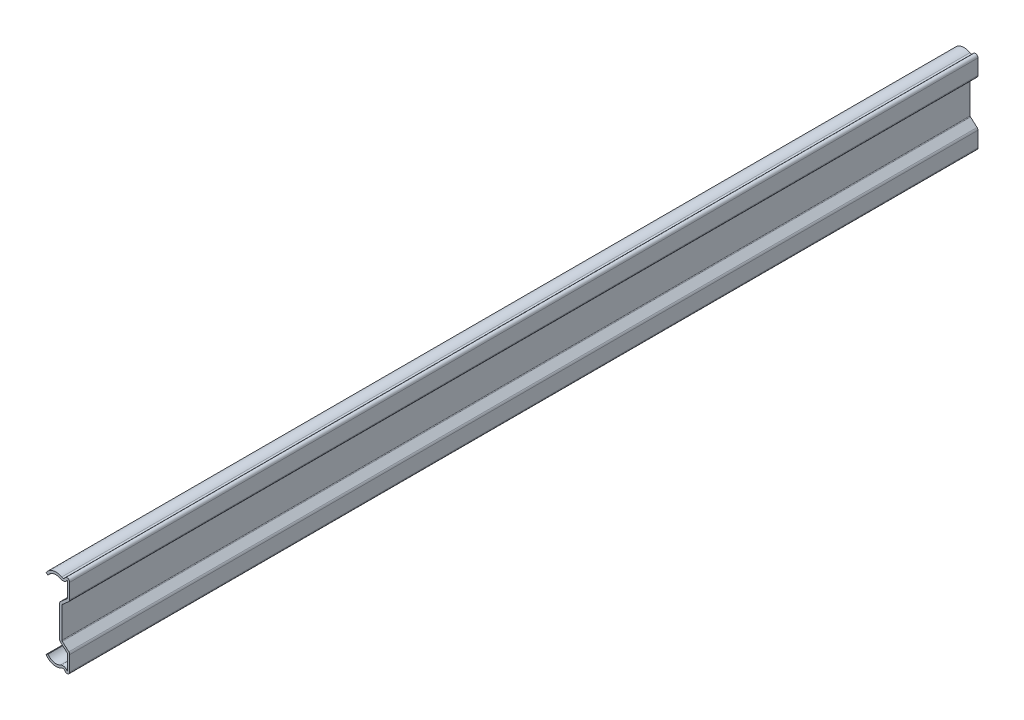
ISO-10303-21;
HEADER;
FILE_DESCRIPTION(('STEP AP214'),'2;1');
FILE_NAME('part.step','',(''),(''),'','','');
FILE_SCHEMA(('AUTOMOTIVE_DESIGN { 1 0 10303 214 1 1 1 1 }'));
ENDSEC;
DATA;
#1=APPLICATION_CONTEXT('core data for automotive mechanical design processes');
#2=APPLICATION_PROTOCOL_DEFINITION('international standard','automotive_design',2000,#1);
#3=PRODUCT_CONTEXT('',#1,'mechanical');
#4=PRODUCT('Part','Part','',(#3));
#5=PRODUCT_RELATED_PRODUCT_CATEGORY('part','',(#4));
#6=PRODUCT_DEFINITION_FORMATION('','',#4);
#7=PRODUCT_DEFINITION_CONTEXT('part definition',#1,'design');
#8=PRODUCT_DEFINITION('design','',#6,#7);
#9=PRODUCT_DEFINITION_SHAPE('','',#8);
#10=(LENGTH_UNIT() NAMED_UNIT(*) SI_UNIT(.MILLI.,.METRE.));
#11=(NAMED_UNIT(*) PLANE_ANGLE_UNIT() SI_UNIT($,.RADIAN.));
#12=(NAMED_UNIT(*) SI_UNIT($,.STERADIAN.) SOLID_ANGLE_UNIT());
#13=UNCERTAINTY_MEASURE_WITH_UNIT(LENGTH_MEASURE(1.E-05),#10,'distance_accuracy_value','');
#14=(GEOMETRIC_REPRESENTATION_CONTEXT(3) GLOBAL_UNCERTAINTY_ASSIGNED_CONTEXT((#13)) GLOBAL_UNIT_ASSIGNED_CONTEXT((#10,
#11,#12)) REPRESENTATION_CONTEXT('',''));
#15=CARTESIAN_POINT('',(0.,0.,0.));
#16=DIRECTION('',(0.,0.,1.));
#17=DIRECTION('',(1.,0.,0.));
#18=AXIS2_PLACEMENT_3D('',#15,#16,#17);
#19=CARTESIAN_POINT('',(-2.6,-10.,-137.));
#20=DIRECTION('',(0.,0.,1.));
#21=DIRECTION('',(1.,0.,0.));
#22=AXIS2_PLACEMENT_3D('',#19,#20,#21);
#23=CYLINDRICAL_SURFACE('',#22,1.1);
#24=DIRECTION('',(0.,0.,-1.));
#25=VECTOR('',#24,1.);
#26=CARTESIAN_POINT('',(-1.5,-10.,-137.));
#27=LINE('',#26,#25);
#28=CARTESIAN_POINT('',(-1.5,-10.,-137.));
#29=VERTEX_POINT('',#28);
#30=CARTESIAN_POINT('',(-1.5,-10.,246.));
#31=VERTEX_POINT('',#30);
#32=EDGE_CURVE('E227',#29,#31,#27,.F.);
#33=ORIENTED_EDGE('',*,*,#32,.F.);
#34=CARTESIAN_POINT('',(-2.6,-10.,-137.));
#35=DIRECTION('',(0.,0.,1.));
#36=DIRECTION('',(1.,0.,0.));
#37=AXIS2_PLACEMENT_3D('',#34,#35,#36);
#38=CIRCLE('',#37,1.1);
#39=CARTESIAN_POINT('',(-1.87795841654397,-9.17014703003465,-137.));
#40=VERTEX_POINT('',#39);
#41=EDGE_CURVE('E232',#29,#40,#38,.T.);
#42=ORIENTED_EDGE('',*,*,#41,.T.);
#43=DIRECTION('',(0.,0.,1.));
#44=VECTOR('',#43,1.);
#45=CARTESIAN_POINT('',(-1.87795841654397,-9.17014703003465,-137.));
#46=LINE('',#45,#44);
#47=CARTESIAN_POINT('',(-1.87795841654397,-9.17014703003465,246.));
#48=VERTEX_POINT('',#47);
#49=EDGE_CURVE('E230',#48,#40,#46,.F.);
#50=ORIENTED_EDGE('',*,*,#49,.F.);
#51=CARTESIAN_POINT('',(-2.6,-10.,246.));
#52=DIRECTION('',(0.,0.,1.));
#53=DIRECTION('',(1.,0.,0.));
#54=AXIS2_PLACEMENT_3D('',#51,#52,#53);
#55=CIRCLE('',#54,1.1);
#56=EDGE_CURVE('E20',#48,#31,#55,.F.);
#57=ORIENTED_EDGE('',*,*,#56,.T.);
#58=EDGE_LOOP('',(#33,#42,#50,#57));
#59=FACE_BOUND('',#58,.T.);
#60=ADVANCED_FACE('F16',(#59),#23,.T.);
#61=CARTESIAN_POINT('',(-4.3,-6.4,-137.));
#62=DIRECTION('',(0.,0.,1.));
#63=DIRECTION('',(1.,0.,0.));
#64=AXIS2_PLACEMENT_3D('',#61,#62,#63);
#65=CYLINDRICAL_SURFACE('',#64,0.5);
#66=DIRECTION('',(0.,0.,-1.));
#67=VECTOR('',#66,1.);
#68=CARTESIAN_POINT('',(-4.8,-6.4,-137.));
#69=LINE('',#68,#67);
#70=CARTESIAN_POINT('',(-4.8,-6.4,246.));
#71=VERTEX_POINT('',#70);
#72=CARTESIAN_POINT('',(-4.8,-6.4,-137.));
#73=VERTEX_POINT('',#72);
#74=EDGE_CURVE('E331',#71,#73,#69,.T.);
#75=ORIENTED_EDGE('',*,*,#74,.F.);
#76=CARTESIAN_POINT('',(-4.3,-6.4,246.));
#77=DIRECTION('',(0.,0.,1.));
#78=DIRECTION('',(1.,0.,0.));
#79=AXIS2_PLACEMENT_3D('',#76,#77,#78);
#80=CIRCLE('',#79,0.5);
#81=CARTESIAN_POINT('',(-4.62820071975274,-6.77720589543879,246.));
#82=VERTEX_POINT('',#81);
#83=EDGE_CURVE('E444',#82,#71,#80,.F.);
#84=ORIENTED_EDGE('',*,*,#83,.F.);
#85=DIRECTION('',(0.,0.,1.));
#86=VECTOR('',#85,1.);
#87=CARTESIAN_POINT('',(-4.62820071975274,-6.77720589543879,-137.));
#88=LINE('',#87,#86);
#89=CARTESIAN_POINT('',(-4.62820071975274,-6.77720589543879,-137.));
#90=VERTEX_POINT('',#89);
#91=EDGE_CURVE('E337',#90,#82,#88,.T.);
#92=ORIENTED_EDGE('',*,*,#91,.F.);
#93=CARTESIAN_POINT('',(-4.3,-6.4,-137.));
#94=DIRECTION('',(0.,0.,1.));
#95=DIRECTION('',(1.,0.,0.));
#96=AXIS2_PLACEMENT_3D('',#93,#94,#95);
#97=CIRCLE('',#96,0.5);
#98=EDGE_CURVE('E442',#73,#90,#97,.T.);
#99=ORIENTED_EDGE('',*,*,#98,.F.);
#100=EDGE_LOOP('',(#75,#84,#92,#99));
#101=FACE_BOUND('',#100,.T.);
#102=ADVANCED_FACE('F788',(#101),#65,.F.);
#103=CARTESIAN_POINT('',(-4.3,6.4,-137.));
#104=DIRECTION('',(0.,0.,1.));
#105=DIRECTION('',(1.,0.,0.));
#106=AXIS2_PLACEMENT_3D('',#103,#104,#105);
#107=CYLINDRICAL_SURFACE('',#106,0.5);
#108=DIRECTION('',(0.,0.,1.));
#109=VECTOR('',#108,1.);
#110=CARTESIAN_POINT('',(-4.62820071975274,6.77720589543879,-137.));
#111=LINE('',#110,#109);
#112=CARTESIAN_POINT('',(-4.62820071975274,6.77720589543879,246.));
#113=VERTEX_POINT('',#112);
#114=CARTESIAN_POINT('',(-4.62820071975274,6.77720589543879,-137.));
#115=VERTEX_POINT('',#114);
#116=EDGE_CURVE('E325',#113,#115,#111,.F.);
#117=ORIENTED_EDGE('',*,*,#116,.F.);
#118=CARTESIAN_POINT('',(-4.3,6.4,246.));
#119=DIRECTION('',(0.,0.,1.));
#120=DIRECTION('',(1.,0.,0.));
#121=AXIS2_PLACEMENT_3D('',#118,#119,#120);
#122=CIRCLE('',#121,0.5);
#123=CARTESIAN_POINT('',(-4.8,6.4,246.));
#124=VERTEX_POINT('',#123);
#125=EDGE_CURVE('E440',#124,#113,#122,.F.);
#126=ORIENTED_EDGE('',*,*,#125,.F.);
#127=DIRECTION('',(0.,0.,-1.));
#128=VECTOR('',#127,1.);
#129=CARTESIAN_POINT('',(-4.8,6.4,-137.));
#130=LINE('',#129,#128);
#131=CARTESIAN_POINT('',(-4.8,6.4,-137.));
#132=VERTEX_POINT('',#131);
#133=EDGE_CURVE('E334',#132,#124,#130,.F.);
#134=ORIENTED_EDGE('',*,*,#133,.F.);
#135=CARTESIAN_POINT('',(-4.3,6.4,-137.));
#136=DIRECTION('',(0.,0.,1.));
#137=DIRECTION('',(1.,0.,0.));
#138=AXIS2_PLACEMENT_3D('',#135,#136,#137);
#139=CIRCLE('',#138,0.5);
#140=EDGE_CURVE('E438',#115,#132,#139,.T.);
#141=ORIENTED_EDGE('',*,*,#140,.F.);
#142=EDGE_LOOP('',(#117,#126,#134,#141));
#143=FACE_BOUND('',#142,.T.);
#144=ADVANCED_FACE('F482',(#143),#107,.F.);
#145=CARTESIAN_POINT('',(-2.6,10.,-137.));
#146=DIRECTION('',(0.,0.,1.));
#147=DIRECTION('',(1.,0.,0.));
#148=AXIS2_PLACEMENT_3D('',#145,#146,#147);
#149=CYLINDRICAL_SURFACE('',#148,1.1);
#150=DIRECTION('',(0.,0.,1.));
#151=VECTOR('',#150,1.);
#152=CARTESIAN_POINT('',(-1.87795841654397,9.17014703003465,-137.));
#153=LINE('',#152,#151);
#154=CARTESIAN_POINT('',(-1.87795841654397,9.17014703003465,-137.));
#155=VERTEX_POINT('',#154);
#156=CARTESIAN_POINT('',(-1.87795841654397,9.17014703003465,246.));
#157=VERTEX_POINT('',#156);
#158=EDGE_CURVE('E328',#155,#157,#153,.T.);
#159=ORIENTED_EDGE('',*,*,#158,.F.);
#160=CARTESIAN_POINT('',(-2.6,10.,-137.));
#161=DIRECTION('',(0.,0.,1.));
#162=DIRECTION('',(1.,0.,0.));
#163=AXIS2_PLACEMENT_3D('',#160,#161,#162);
#164=CIRCLE('',#163,1.1);
#165=CARTESIAN_POINT('',(-1.5,10.,-137.));
#166=VERTEX_POINT('',#165);
#167=EDGE_CURVE('E434',#155,#166,#164,.T.);
#168=ORIENTED_EDGE('',*,*,#167,.T.);
#169=DIRECTION('',(0.,0.,-1.));
#170=VECTOR('',#169,1.);
#171=CARTESIAN_POINT('',(-1.5,10.,-137.));
#172=LINE('',#171,#170);
#173=CARTESIAN_POINT('',(-1.5,10.,246.));
#174=VERTEX_POINT('',#173);
#175=EDGE_CURVE('E320',#174,#166,#172,.T.);
#176=ORIENTED_EDGE('',*,*,#175,.F.);
#177=CARTESIAN_POINT('',(-2.6,10.,246.));
#178=DIRECTION('',(0.,0.,1.));
#179=DIRECTION('',(1.,0.,0.));
#180=AXIS2_PLACEMENT_3D('',#177,#178,#179);
#181=CIRCLE('',#180,1.1);
#182=EDGE_CURVE('E436',#174,#157,#181,.F.);
#183=ORIENTED_EDGE('',*,*,#182,.T.);
#184=EDGE_LOOP('',(#159,#168,#176,#183));
#185=FACE_BOUND('',#184,.T.);
#186=ADVANCED_FACE('F492',(#185),#149,.T.);
#187=CARTESIAN_POINT('',(-4.3931393476717,17.4930010429233,-137.));
#188=DIRECTION('',(0.,0.,1.));
#189=DIRECTION('',(1.,0.,0.));
#190=AXIS2_PLACEMENT_3D('',#187,#188,#189);
#191=CYLINDRICAL_SURFACE('',#190,1.);
#192=CARTESIAN_POINT('',(-4.3931393476717,17.4930010429233,246.));
#193=DIRECTION('',(0.,0.,1.));
#194=DIRECTION('',(1.,0.,0.));
#195=AXIS2_PLACEMENT_3D('',#192,#193,#194);
#196=CIRCLE('',#195,1.);
#197=CARTESIAN_POINT('',(-3.53926346782803,16.972524355817,246.));
#198=VERTEX_POINT('',#197);
#199=CARTESIAN_POINT('',(-4.87936460593698,16.6191675357694,246.));
#200=VERTEX_POINT('',#199);
#201=EDGE_CURVE('E356',#198,#200,#196,.F.);
#202=ORIENTED_EDGE('',*,*,#201,.F.);
#203=DIRECTION('',(0.,0.,1.));
#204=VECTOR('',#203,1.);
#205=CARTESIAN_POINT('',(-3.53926346782804,16.972524355817,-137.));
#206=LINE('',#205,#204);
#207=CARTESIAN_POINT('',(-3.53926346782803,16.972524355817,-137.));
#208=VERTEX_POINT('',#207);
#209=EDGE_CURVE('E317',#208,#198,#206,.T.);
#210=ORIENTED_EDGE('',*,*,#209,.F.);
#211=CARTESIAN_POINT('',(-4.3931393476717,17.4930010429233,-137.));
#212=DIRECTION('',(0.,0.,1.));
#213=DIRECTION('',(1.,0.,0.));
#214=AXIS2_PLACEMENT_3D('',#211,#212,#213);
#215=CIRCLE('',#214,1.);
#216=CARTESIAN_POINT('',(-4.87936460593698,16.6191675357694,-137.));
#217=VERTEX_POINT('',#216);
#218=EDGE_CURVE('E432',#217,#208,#215,.T.);
#219=ORIENTED_EDGE('',*,*,#218,.F.);
#220=DIRECTION('',(0.,0.,1.));
#221=VECTOR('',#220,1.);
#222=CARTESIAN_POINT('',(-4.87936460593698,16.6191675357694,-137.));
#223=LINE('',#222,#221);
#224=EDGE_CURVE('E310',#200,#217,#223,.F.);
#225=ORIENTED_EDGE('',*,*,#224,.F.);
#226=EDGE_LOOP('',(#202,#210,#219,#225));
#227=FACE_BOUND('',#226,.T.);
#228=ADVANCED_FACE('F504',(#227),#191,.F.);
#229=CARTESIAN_POINT('',(-11.5104908972634,14.9629319932501,-137.));
#230=DIRECTION('',(-0.542586398650022,-0.84,0.));
#231=DIRECTION('',(0.84,-0.542586398650022,0.));
#232=AXIS2_PLACEMENT_3D('',#229,#230,#231);
#233=PLANE('',#232);
#234=DIRECTION('',(0.,0.,1.));
#235=VECTOR('',#234,1.);
#236=CARTESIAN_POINT('',(-11.5104908972634,14.9629319932501,-137.));
#237=LINE('',#236,#235);
#238=CARTESIAN_POINT('',(-11.5104908972634,14.9629319932501,-137.));
#239=VERTEX_POINT('',#238);
#240=CARTESIAN_POINT('',(-11.5104908972634,14.9629319932501,246.));
#241=VERTEX_POINT('',#240);
#242=EDGE_CURVE('E311',#239,#241,#237,.T.);
#243=ORIENTED_EDGE('',*,*,#242,.F.);
#244=DIRECTION('',(0.84,-0.542586398650022,0.));
#245=VECTOR('',#244,1.);
#246=CARTESIAN_POINT('',(-11.5104908972634,14.9629319932501,-137.));
#247=LINE('',#246,#245);
#248=CARTESIAN_POINT('',(-10.6704908972634,14.4203455946001,-137.));
#249=VERTEX_POINT('',#248);
#250=EDGE_CURVE('E351',#239,#249,#247,.T.);
#251=ORIENTED_EDGE('',*,*,#250,.T.);
#252=DIRECTION('',(0.,0.,1.));
#253=VECTOR('',#252,1.);
#254=CARTESIAN_POINT('',(-10.6704908972634,14.4203455946001,-137.));
#255=LINE('',#254,#253);
#256=CARTESIAN_POINT('',(-10.6704908972634,14.4203455946001,246.));
#257=VERTEX_POINT('',#256);
#258=EDGE_CURVE('E305',#249,#257,#255,.T.);
#259=ORIENTED_EDGE('',*,*,#258,.T.);
#260=DIRECTION('',(0.84,-0.542586398650022,0.));
#261=VECTOR('',#260,1.);
#262=CARTESIAN_POINT('',(-11.5104908972634,14.9629319932501,246.));
#263=LINE('',#262,#261);
#264=EDGE_CURVE('E354',#257,#241,#263,.F.);
#265=ORIENTED_EDGE('',*,*,#264,.T.);
#266=EDGE_LOOP('',(#243,#251,#259,#265));
#267=FACE_BOUND('',#266,.T.);
#268=ADVANCED_FACE('F510',(#267),#233,.T.);
#269=CARTESIAN_POINT('',(-2.6,16.4,-137.));
#270=DIRECTION('',(0.,0.,1.));
#271=DIRECTION('',(1.,0.,0.));
#272=AXIS2_PLACEMENT_3D('',#269,#270,#271);
#273=CYLINDRICAL_SURFACE('',#272,0.0999999999999999);
#274=CARTESIAN_POINT('',(-2.6,16.4,246.));
#275=DIRECTION('',(0.,0.,1.));
#276=DIRECTION('',(1.,0.,0.));
#277=AXIS2_PLACEMENT_3D('',#274,#275,#276);
#278=CIRCLE('',#277,0.0999999999999999);
#279=CARTESIAN_POINT('',(-2.68538758798437,16.4520476687106,246.));
#280=VERTEX_POINT('',#279);
#281=CARTESIAN_POINT('',(-2.5,16.4,246.));
#282=VERTEX_POINT('',#281);
#283=EDGE_CURVE('E428',#280,#282,#278,.F.);
#284=ORIENTED_EDGE('',*,*,#283,.F.);
#285=DIRECTION('',(0.,0.,1.));
#286=VECTOR('',#285,1.);
#287=CARTESIAN_POINT('',(-2.68538758798436,16.4520476687106,-137.));
#288=LINE('',#287,#286);
#289=CARTESIAN_POINT('',(-2.68538758798437,16.4520476687106,-137.));
#290=VERTEX_POINT('',#289);
#291=EDGE_CURVE('E302',#290,#280,#288,.T.);
#292=ORIENTED_EDGE('',*,*,#291,.F.);
#293=CARTESIAN_POINT('',(-2.6,16.4,-137.));
#294=DIRECTION('',(0.,0.,1.));
#295=DIRECTION('',(1.,0.,0.));
#296=AXIS2_PLACEMENT_3D('',#293,#294,#295);
#297=CIRCLE('',#296,0.0999999999999999);
#298=CARTESIAN_POINT('',(-2.5,16.4,-137.));
#299=VERTEX_POINT('',#298);
#300=EDGE_CURVE('E353',#299,#290,#297,.T.);
#301=ORIENTED_EDGE('',*,*,#300,.F.);
#302=DIRECTION('',(0.,0.,1.));
#303=VECTOR('',#302,1.);
#304=CARTESIAN_POINT('',(-2.5,16.4,-137.));
#305=LINE('',#304,#303);
#306=EDGE_CURVE('E290',#282,#299,#305,.F.);
#307=ORIENTED_EDGE('',*,*,#306,.F.);
#308=EDGE_LOOP('',(#284,#292,#301,#307));
#309=FACE_BOUND('',#308,.T.);
#310=ADVANCED_FACE('F522',(#309),#273,.F.);
#311=CARTESIAN_POINT('',(-2.6,-10.,-137.));
#312=DIRECTION('',(0.,0.,1.));
#313=DIRECTION('',(1.,0.,0.));
#314=AXIS2_PLACEMENT_3D('',#311,#312,#313);
#315=CYLINDRICAL_SURFACE('',#314,0.0999999999999999);
#316=CARTESIAN_POINT('',(-2.6,-10.,246.));
#317=DIRECTION('',(0.,0.,1.));
#318=DIRECTION('',(1.,0.,0.));
#319=AXIS2_PLACEMENT_3D('',#316,#317,#318);
#320=CIRCLE('',#319,0.0999999999999999);
#321=CARTESIAN_POINT('',(-2.53435985604945,-9.92455882091224,246.));
#322=VERTEX_POINT('',#321);
#323=CARTESIAN_POINT('',(-2.5,-10.,246.));
#324=VERTEX_POINT('',#323);
#325=EDGE_CURVE('E424',#322,#324,#320,.F.);
#326=ORIENTED_EDGE('',*,*,#325,.F.);
#327=DIRECTION('',(0.,0.,1.));
#328=VECTOR('',#327,1.);
#329=CARTESIAN_POINT('',(-2.53435985604945,-9.92455882091224,-137.));
#330=LINE('',#329,#328);
#331=CARTESIAN_POINT('',(-2.53435985604945,-9.92455882091224,-137.));
#332=VERTEX_POINT('',#331);
#333=EDGE_CURVE('E287',#332,#322,#330,.T.);
#334=ORIENTED_EDGE('',*,*,#333,.F.);
#335=CARTESIAN_POINT('',(-2.6,-10.,-137.));
#336=DIRECTION('',(0.,0.,1.));
#337=DIRECTION('',(1.,0.,0.));
#338=AXIS2_PLACEMENT_3D('',#335,#336,#337);
#339=CIRCLE('',#338,0.0999999999999999);
#340=CARTESIAN_POINT('',(-2.5,-10.,-137.));
#341=VERTEX_POINT('',#340);
#342=EDGE_CURVE('E426',#341,#332,#339,.T.);
#343=ORIENTED_EDGE('',*,*,#342,.F.);
#344=DIRECTION('',(0.,0.,1.));
#345=VECTOR('',#344,1.);
#346=CARTESIAN_POINT('',(-2.5,-10.,-137.));
#347=LINE('',#346,#345);
#348=EDGE_CURVE('E281',#324,#341,#347,.F.);
#349=ORIENTED_EDGE('',*,*,#348,.F.);
#350=EDGE_LOOP('',(#326,#334,#343,#349));
#351=FACE_BOUND('',#350,.T.);
#352=ADVANCED_FACE('F554',(#351),#315,.F.);
#353=CARTESIAN_POINT('',(-2.6,-16.4,-137.));
#354=DIRECTION('',(0.,0.,1.));
#355=DIRECTION('',(1.,0.,0.));
#356=AXIS2_PLACEMENT_3D('',#353,#354,#355);
#357=CYLINDRICAL_SURFACE('',#356,0.0999999999999999);
#358=CARTESIAN_POINT('',(-2.6,-16.4,246.));
#359=DIRECTION('',(0.,0.,1.));
#360=DIRECTION('',(1.,0.,0.));
#361=AXIS2_PLACEMENT_3D('',#358,#359,#360);
#362=CIRCLE('',#361,0.0999999999999999);
#363=CARTESIAN_POINT('',(-2.5,-16.4,246.));
#364=VERTEX_POINT('',#363);
#365=CARTESIAN_POINT('',(-2.68538758798437,-16.4520476687106,246.));
#366=VERTEX_POINT('',#365);
#367=EDGE_CURVE('E420',#364,#366,#362,.F.);
#368=ORIENTED_EDGE('',*,*,#367,.F.);
#369=DIRECTION('',(0.,0.,1.));
#370=VECTOR('',#369,1.);
#371=CARTESIAN_POINT('',(-2.5,-16.4,-137.));
#372=LINE('',#371,#370);
#373=CARTESIAN_POINT('',(-2.5,-16.4,-137.));
#374=VERTEX_POINT('',#373);
#375=EDGE_CURVE('E284',#374,#364,#372,.T.);
#376=ORIENTED_EDGE('',*,*,#375,.F.);
#377=CARTESIAN_POINT('',(-2.6,-16.4,-137.));
#378=DIRECTION('',(0.,0.,1.));
#379=DIRECTION('',(1.,0.,0.));
#380=AXIS2_PLACEMENT_3D('',#377,#378,#379);
#381=CIRCLE('',#380,0.0999999999999999);
#382=CARTESIAN_POINT('',(-2.68538758798437,-16.4520476687106,-137.));
#383=VERTEX_POINT('',#382);
#384=EDGE_CURVE('E422',#383,#374,#381,.T.);
#385=ORIENTED_EDGE('',*,*,#384,.F.);
#386=DIRECTION('',(0.,0.,1.));
#387=VECTOR('',#386,1.);
#388=CARTESIAN_POINT('',(-2.68538758798436,-16.4520476687106,-137.));
#389=LINE('',#388,#387);
#390=EDGE_CURVE('E276',#366,#383,#389,.F.);
#391=ORIENTED_EDGE('',*,*,#390,.F.);
#392=EDGE_LOOP('',(#368,#376,#385,#391));
#393=FACE_BOUND('',#392,.T.);
#394=ADVANCED_FACE('F564',(#393),#357,.F.);
#395=CARTESIAN_POINT('',(-4.3931393476717,-17.4930010429233,-137.));
#396=DIRECTION('',(0.,0.,1.));
#397=DIRECTION('',(1.,0.,0.));
#398=AXIS2_PLACEMENT_3D('',#395,#396,#397);
#399=CYLINDRICAL_SURFACE('',#398,1.);
#400=CARTESIAN_POINT('',(-4.3931393476717,-17.4930010429233,246.));
#401=DIRECTION('',(0.,0.,1.));
#402=DIRECTION('',(1.,0.,0.));
#403=AXIS2_PLACEMENT_3D('',#400,#401,#402);
#404=CIRCLE('',#403,1.);
#405=CARTESIAN_POINT('',(-4.87936460593698,-16.6191675357694,246.));
#406=VERTEX_POINT('',#405);
#407=CARTESIAN_POINT('',(-3.53926346782803,-16.972524355817,246.));
#408=VERTEX_POINT('',#407);
#409=EDGE_CURVE('E348',#406,#408,#404,.F.);
#410=ORIENTED_EDGE('',*,*,#409,.F.);
#411=DIRECTION('',(0.,0.,1.));
#412=VECTOR('',#411,1.);
#413=CARTESIAN_POINT('',(-4.87936460593698,-16.6191675357694,-137.));
#414=LINE('',#413,#412);
#415=CARTESIAN_POINT('',(-4.87936460593698,-16.6191675357694,-137.));
#416=VERTEX_POINT('',#415);
#417=EDGE_CURVE('E266',#416,#406,#414,.T.);
#418=ORIENTED_EDGE('',*,*,#417,.F.);
#419=CARTESIAN_POINT('',(-4.3931393476717,-17.4930010429233,-137.));
#420=DIRECTION('',(0.,0.,1.));
#421=DIRECTION('',(1.,0.,0.));
#422=AXIS2_PLACEMENT_3D('',#419,#420,#421);
#423=CIRCLE('',#422,1.);
#424=CARTESIAN_POINT('',(-3.53926346782803,-16.972524355817,-137.));
#425=VERTEX_POINT('',#424);
#426=EDGE_CURVE('E418',#425,#416,#423,.T.);
#427=ORIENTED_EDGE('',*,*,#426,.F.);
#428=DIRECTION('',(0.,0.,1.));
#429=VECTOR('',#428,1.);
#430=CARTESIAN_POINT('',(-3.53926346782804,-16.972524355817,-137.));
#431=LINE('',#430,#429);
#432=EDGE_CURVE('E242',#408,#425,#431,.F.);
#433=ORIENTED_EDGE('',*,*,#432,.F.);
#434=EDGE_LOOP('',(#410,#418,#427,#433));
#435=FACE_BOUND('',#434,.T.);
#436=ADVANCED_FACE('F584',(#435),#399,.F.);
#437=CARTESIAN_POINT('',(-10.6704908972634,-14.4203455946001,-137.));
#438=DIRECTION('',(-0.542586398650022,0.84,0.));
#439=DIRECTION('',(-0.84,-0.542586398650022,0.));
#440=AXIS2_PLACEMENT_3D('',#437,#438,#439);
#441=PLANE('',#440);
#442=DIRECTION('',(0.,0.,1.));
#443=VECTOR('',#442,1.);
#444=CARTESIAN_POINT('',(-10.6704908972634,-14.4203455946001,-137.));
#445=LINE('',#444,#443);
#446=CARTESIAN_POINT('',(-10.6704908972634,-14.4203455946001,246.));
#447=VERTEX_POINT('',#446);
#448=CARTESIAN_POINT('',(-10.6704908972634,-14.4203455946001,-137.));
#449=VERTEX_POINT('',#448);
#450=EDGE_CURVE('E270',#447,#449,#445,.F.);
#451=ORIENTED_EDGE('',*,*,#450,.T.);
#452=DIRECTION('',(-0.84,-0.542586398650022,0.));
#453=VECTOR('',#452,1.);
#454=CARTESIAN_POINT('',(-10.6704908972634,-14.4203455946001,-137.));
#455=LINE('',#454,#453);
#456=CARTESIAN_POINT('',(-11.5104908972634,-14.9629319932501,-137.));
#457=VERTEX_POINT('',#456);
#458=EDGE_CURVE('E347',#449,#457,#455,.T.);
#459=ORIENTED_EDGE('',*,*,#458,.T.);
#460=DIRECTION('',(0.,0.,1.));
#461=VECTOR('',#460,1.);
#462=CARTESIAN_POINT('',(-11.5104908972634,-14.9629319932501,-137.));
#463=LINE('',#462,#461);
#464=CARTESIAN_POINT('',(-11.5104908972634,-14.9629319932501,246.));
#465=VERTEX_POINT('',#464);
#466=EDGE_CURVE('E269',#465,#457,#463,.F.);
#467=ORIENTED_EDGE('',*,*,#466,.F.);
#468=DIRECTION('',(-0.84,-0.542586398650022,0.));
#469=VECTOR('',#468,1.);
#470=CARTESIAN_POINT('',(-10.6704908972634,-14.4203455946001,246.));
#471=LINE('',#470,#469);
#472=EDGE_CURVE('E345',#465,#447,#471,.F.);
#473=ORIENTED_EDGE('',*,*,#472,.T.);
#474=EDGE_LOOP('',(#451,#459,#467,#473));
#475=FACE_BOUND('',#474,.T.);
#476=ADVANCED_FACE('F576',(#475),#441,.T.);
#477=CARTESIAN_POINT('',(-2.6,10.,-137.));
#478=DIRECTION('',(0.,0.,1.));
#479=DIRECTION('',(1.,0.,0.));
#480=AXIS2_PLACEMENT_3D('',#477,#478,#479);
#481=CYLINDRICAL_SURFACE('',#480,0.0999999999999999);
#482=CARTESIAN_POINT('',(-2.6,10.,246.));
#483=DIRECTION('',(0.,0.,1.));
#484=DIRECTION('',(1.,0.,0.));
#485=AXIS2_PLACEMENT_3D('',#482,#483,#484);
#486=CIRCLE('',#485,0.0999999999999999);
#487=CARTESIAN_POINT('',(-2.5,10.,246.));
#488=VERTEX_POINT('',#487);
#489=CARTESIAN_POINT('',(-2.53435985604945,9.92455882091224,246.));
#490=VERTEX_POINT('',#489);
#491=EDGE_CURVE('E344',#488,#490,#486,.F.);
#492=ORIENTED_EDGE('',*,*,#491,.F.);
#493=DIRECTION('',(0.,0.,1.));
#494=VECTOR('',#493,1.);
#495=CARTESIAN_POINT('',(-2.5,10.,-137.));
#496=LINE('',#495,#494);
#497=CARTESIAN_POINT('',(-2.5,10.,-137.));
#498=VERTEX_POINT('',#497);
#499=EDGE_CURVE('E298',#498,#488,#496,.T.);
#500=ORIENTED_EDGE('',*,*,#499,.F.);
#501=CARTESIAN_POINT('',(-2.6,10.,-137.));
#502=DIRECTION('',(0.,0.,1.));
#503=DIRECTION('',(1.,0.,0.));
#504=AXIS2_PLACEMENT_3D('',#501,#502,#503);
#505=CIRCLE('',#504,0.0999999999999999);
#506=CARTESIAN_POINT('',(-2.53435985604945,9.92455882091224,-137.));
#507=VERTEX_POINT('',#506);
#508=EDGE_CURVE('E350',#507,#498,#505,.T.);
#509=ORIENTED_EDGE('',*,*,#508,.F.);
#510=DIRECTION('',(0.,0.,1.));
#511=VECTOR('',#510,1.);
#512=CARTESIAN_POINT('',(-2.53435985604945,9.92455882091224,-137.));
#513=LINE('',#512,#511);
#514=EDGE_CURVE('E273',#490,#507,#513,.F.);
#515=ORIENTED_EDGE('',*,*,#514,.F.);
#516=EDGE_LOOP('',(#492,#500,#509,#515));
#517=FACE_BOUND('',#516,.T.);
#518=ADVANCED_FACE('F532',(#517),#481,.F.);
#519=CARTESIAN_POINT('',(-2.6,-16.4,-137.));
#520=DIRECTION('',(0.,0.,1.));
#521=DIRECTION('',(1.,0.,0.));
#522=AXIS2_PLACEMENT_3D('',#519,#520,#521);
#523=CYLINDRICAL_SURFACE('',#522,1.1);
#524=ORIENTED_EDGE('',*,*,#432,.T.);
#525=CARTESIAN_POINT('',(-2.6,-16.4,-137.));
#526=DIRECTION('',(0.,0.,1.));
#527=DIRECTION('',(1.,0.,0.));
#528=AXIS2_PLACEMENT_3D('',#525,#526,#527);
#529=CIRCLE('',#528,1.1);
#530=CARTESIAN_POINT('',(-1.5,-16.4,-137.));
#531=VERTEX_POINT('',#530);
#532=EDGE_CURVE('E411',#425,#531,#529,.T.);
#533=ORIENTED_EDGE('',*,*,#532,.T.);
#534=DIRECTION('',(0.,0.,-1.));
#535=VECTOR('',#534,1.);
#536=CARTESIAN_POINT('',(-1.5,-16.4,-137.));
#537=LINE('',#536,#535);
#538=CARTESIAN_POINT('',(-1.5,-16.4,246.));
#539=VERTEX_POINT('',#538);
#540=EDGE_CURVE('E241',#539,#531,#537,.T.);
#541=ORIENTED_EDGE('',*,*,#540,.F.);
#542=CARTESIAN_POINT('',(-2.6,-16.4,246.));
#543=DIRECTION('',(0.,0.,1.));
#544=DIRECTION('',(1.,0.,0.));
#545=AXIS2_PLACEMENT_3D('',#542,#543,#544);
#546=CIRCLE('',#545,1.1);
#547=EDGE_CURVE('E246',#408,#539,#546,.T.);
#548=ORIENTED_EDGE('',*,*,#547,.F.);
#549=EDGE_LOOP('',(#524,#533,#541,#548));
#550=FACE_BOUND('',#549,.T.);
#551=ADVANCED_FACE('F587',(#550),#523,.T.);
#552=CARTESIAN_POINT('',(-1.5,-16.4,-137.));
#553=DIRECTION('',(1.,0.,0.));
#554=DIRECTION('',(0.,0.,-1.));
#555=AXIS2_PLACEMENT_3D('',#552,#553,#554);
#556=PLANE('',#555);
#557=ORIENTED_EDGE('',*,*,#540,.T.);
#558=DIRECTION('',(0.,1.,0.));
#559=VECTOR('',#558,1.);
#560=CARTESIAN_POINT('',(-1.5,0.,-137.));
#561=LINE('',#560,#559);
#562=EDGE_CURVE('E240',#531,#29,#561,.T.);
#563=ORIENTED_EDGE('',*,*,#562,.T.);
#564=ORIENTED_EDGE('',*,*,#32,.T.);
#565=DIRECTION('',(0.,1.,0.));
#566=VECTOR('',#565,1.);
#567=CARTESIAN_POINT('',(-1.5,0.,246.));
#568=LINE('',#567,#566);
#569=EDGE_CURVE('E237',#539,#31,#568,.T.);
#570=ORIENTED_EDGE('',*,*,#569,.F.);
#571=EDGE_LOOP('',(#557,#563,#564,#570));
#572=FACE_BOUND('',#571,.T.);
#573=ADVANCED_FACE('F236',(#572),#556,.T.);
#574=CARTESIAN_POINT('',(-1.87795841654397,-9.17014703003465,-137.));
#575=DIRECTION('',(0.656401439505482,0.754411790877589,0.));
#576=DIRECTION('',(-0.754411790877589,0.656401439505482,0.));
#577=AXIS2_PLACEMENT_3D('',#574,#575,#576);
#578=PLANE('',#577);
#579=DIRECTION('',(-0.754411790877589,0.656401439505482,0.));
#580=VECTOR('',#579,1.);
#581=CARTESIAN_POINT('',(-1.87795841654397,-9.17014703003465,-137.));
#582=LINE('',#581,#580);
#583=EDGE_CURVE('E450',#40,#90,#582,.T.);
#584=ORIENTED_EDGE('',*,*,#583,.T.);
#585=ORIENTED_EDGE('',*,*,#91,.T.);
#586=DIRECTION('',(-0.754411790877589,0.656401439505482,0.));
#587=VECTOR('',#586,1.);
#588=CARTESIAN_POINT('',(-1.87795841654397,-9.17014703003465,246.));
#589=LINE('',#588,#587);
#590=EDGE_CURVE('E247',#48,#82,#589,.T.);
#591=ORIENTED_EDGE('',*,*,#590,.F.);
#592=ORIENTED_EDGE('',*,*,#49,.T.);
#593=EDGE_LOOP('',(#584,#585,#591,#592));
#594=FACE_BOUND('',#593,.T.);
#595=ADVANCED_FACE('F449',(#594),#578,.T.);
#596=CARTESIAN_POINT('',(-4.8,-6.4,-137.));
#597=DIRECTION('',(1.,0.,0.));
#598=DIRECTION('',(0.,0.,-1.));
#599=AXIS2_PLACEMENT_3D('',#596,#597,#598);
#600=PLANE('',#599);
#601=DIRECTION('',(0.,1.,0.));
#602=VECTOR('',#601,1.);
#603=CARTESIAN_POINT('',(-4.8,0.,246.));
#604=LINE('',#603,#602);
#605=EDGE_CURVE('E249',#71,#124,#604,.T.);
#606=ORIENTED_EDGE('',*,*,#605,.F.);
#607=ORIENTED_EDGE('',*,*,#74,.T.);
#608=DIRECTION('',(0.,1.,0.));
#609=VECTOR('',#608,1.);
#610=CARTESIAN_POINT('',(-4.8,0.,-137.));
#611=LINE('',#610,#609);
#612=EDGE_CURVE('E455',#73,#132,#611,.T.);
#613=ORIENTED_EDGE('',*,*,#612,.T.);
#614=ORIENTED_EDGE('',*,*,#133,.T.);
#615=EDGE_LOOP('',(#606,#607,#613,#614));
#616=FACE_BOUND('',#615,.T.);
#617=ADVANCED_FACE('F479',(#616),#600,.T.);
#618=CARTESIAN_POINT('',(-4.62820071975274,6.77720589543879,-137.));
#619=DIRECTION('',(0.656401439505482,-0.754411790877589,0.));
#620=DIRECTION('',(0.754411790877589,0.656401439505482,0.));
#621=AXIS2_PLACEMENT_3D('',#618,#619,#620);
#622=PLANE('',#621);
#623=DIRECTION('',(0.754411790877589,0.656401439505482,0.));
#624=VECTOR('',#623,1.);
#625=CARTESIAN_POINT('',(-4.62820071975274,6.77720589543879,246.));
#626=LINE('',#625,#624);
#627=EDGE_CURVE('E472',#113,#157,#626,.T.);
#628=ORIENTED_EDGE('',*,*,#627,.F.);
#629=ORIENTED_EDGE('',*,*,#116,.T.);
#630=DIRECTION('',(0.754411790877589,0.656401439505482,0.));
#631=VECTOR('',#630,1.);
#632=CARTESIAN_POINT('',(-4.62820071975274,6.77720589543879,-137.));
#633=LINE('',#632,#631);
#634=EDGE_CURVE('E458',#115,#155,#633,.T.);
#635=ORIENTED_EDGE('',*,*,#634,.T.);
#636=ORIENTED_EDGE('',*,*,#158,.T.);
#637=EDGE_LOOP('',(#628,#629,#635,#636));
#638=FACE_BOUND('',#637,.T.);
#639=ADVANCED_FACE('F487',(#638),#622,.T.);
#640=CARTESIAN_POINT('',(-1.5,10.,-137.));
#641=DIRECTION('',(1.,0.,0.));
#642=DIRECTION('',(0.,0.,-1.));
#643=AXIS2_PLACEMENT_3D('',#640,#641,#642);
#644=PLANE('',#643);
#645=ORIENTED_EDGE('',*,*,#175,.T.);
#646=DIRECTION('',(0.,1.,0.));
#647=VECTOR('',#646,1.);
#648=CARTESIAN_POINT('',(-1.5,0.,-137.));
#649=LINE('',#648,#647);
#650=CARTESIAN_POINT('',(-1.5,16.4,-137.));
#651=VERTEX_POINT('',#650);
#652=EDGE_CURVE('E410',#166,#651,#649,.T.);
#653=ORIENTED_EDGE('',*,*,#652,.T.);
#654=DIRECTION('',(0.,0.,1.));
#655=VECTOR('',#654,1.);
#656=CARTESIAN_POINT('',(-1.5,16.4,-137.));
#657=LINE('',#656,#655);
#658=CARTESIAN_POINT('',(-1.5,16.4,246.));
#659=VERTEX_POINT('',#658);
#660=EDGE_CURVE('E314',#659,#651,#657,.F.);
#661=ORIENTED_EDGE('',*,*,#660,.F.);
#662=DIRECTION('',(0.,1.,0.));
#663=VECTOR('',#662,1.);
#664=CARTESIAN_POINT('',(-1.5,0.,246.));
#665=LINE('',#664,#663);
#666=EDGE_CURVE('E388',#174,#659,#665,.T.);
#667=ORIENTED_EDGE('',*,*,#666,.F.);
#668=EDGE_LOOP('',(#645,#653,#661,#667));
#669=FACE_BOUND('',#668,.T.);
#670=ADVANCED_FACE('F495',(#669),#644,.T.);
#671=CARTESIAN_POINT('',(-2.6,16.4,-137.));
#672=DIRECTION('',(0.,0.,1.));
#673=DIRECTION('',(1.,0.,0.));
#674=AXIS2_PLACEMENT_3D('',#671,#672,#673);
#675=CYLINDRICAL_SURFACE('',#674,1.1);
#676=ORIENTED_EDGE('',*,*,#660,.T.);
#677=CARTESIAN_POINT('',(-2.6,16.4,-137.));
#678=DIRECTION('',(0.,0.,1.));
#679=DIRECTION('',(1.,0.,0.));
#680=AXIS2_PLACEMENT_3D('',#677,#678,#679);
#681=CIRCLE('',#680,1.1);
#682=EDGE_CURVE('E407',#651,#208,#681,.T.);
#683=ORIENTED_EDGE('',*,*,#682,.T.);
#684=ORIENTED_EDGE('',*,*,#209,.T.);
#685=CARTESIAN_POINT('',(-2.6,16.4,246.));
#686=DIRECTION('',(0.,0.,1.));
#687=DIRECTION('',(1.,0.,0.));
#688=AXIS2_PLACEMENT_3D('',#685,#686,#687);
#689=CIRCLE('',#688,1.1);
#690=EDGE_CURVE('E386',#659,#198,#689,.T.);
#691=ORIENTED_EDGE('',*,*,#690,.F.);
#692=EDGE_LOOP('',(#676,#683,#684,#691));
#693=FACE_BOUND('',#692,.T.);
#694=ADVANCED_FACE('F499',(#693),#675,.T.);
#695=CARTESIAN_POINT('',(-7.31049089726336,12.25,-137.));
#696=DIRECTION('',(0.,0.,1.));
#697=DIRECTION('',(1.,0.,0.));
#698=AXIS2_PLACEMENT_3D('',#695,#696,#697);
#699=CYLINDRICAL_SURFACE('',#698,5.);
#700=ORIENTED_EDGE('',*,*,#224,.T.);
#701=CARTESIAN_POINT('',(-7.31049089726336,12.25,-137.));
#702=DIRECTION('',(0.,0.,1.));
#703=DIRECTION('',(1.,0.,0.));
#704=AXIS2_PLACEMENT_3D('',#701,#702,#703);
#705=CIRCLE('',#704,5.);
#706=EDGE_CURVE('E404',#217,#239,#705,.T.);
#707=ORIENTED_EDGE('',*,*,#706,.T.);
#708=ORIENTED_EDGE('',*,*,#242,.T.);
#709=CARTESIAN_POINT('',(-7.31049089726336,12.25,246.));
#710=DIRECTION('',(0.,0.,1.));
#711=DIRECTION('',(1.,0.,0.));
#712=AXIS2_PLACEMENT_3D('',#709,#710,#711);
#713=CIRCLE('',#712,5.);
#714=EDGE_CURVE('E383',#200,#241,#713,.T.);
#715=ORIENTED_EDGE('',*,*,#714,.F.);
#716=EDGE_LOOP('',(#700,#707,#708,#715));
#717=FACE_BOUND('',#716,.T.);
#718=ADVANCED_FACE('F507',(#717),#699,.T.);
#719=CARTESIAN_POINT('',(-7.31049089726336,12.25,-137.));
#720=DIRECTION('',(0.,0.,1.));
#721=DIRECTION('',(1.,0.,0.));
#722=AXIS2_PLACEMENT_3D('',#719,#720,#721);
#723=CYLINDRICAL_SURFACE('',#722,4.);
#724=CARTESIAN_POINT('',(-7.31049089726336,12.25,246.));
#725=DIRECTION('',(0.,0.,1.));
#726=DIRECTION('',(1.,0.,0.));
#727=AXIS2_PLACEMENT_3D('',#724,#725,#726);
#728=CIRCLE('',#727,4.);
#729=CARTESIAN_POINT('',(-5.36558986420225,15.7453340286156,246.));
#730=VERTEX_POINT('',#729);
#731=EDGE_CURVE('E380',#257,#730,#728,.F.);
#732=ORIENTED_EDGE('',*,*,#731,.F.);
#733=ORIENTED_EDGE('',*,*,#258,.F.);
#734=CARTESIAN_POINT('',(-7.31049089726336,12.25,-137.));
#735=DIRECTION('',(0.,0.,1.));
#736=DIRECTION('',(1.,0.,0.));
#737=AXIS2_PLACEMENT_3D('',#734,#735,#736);
#738=CIRCLE('',#737,4.);
#739=CARTESIAN_POINT('',(-5.36558986420225,15.7453340286156,-137.));
#740=VERTEX_POINT('',#739);
#741=EDGE_CURVE('E402',#249,#740,#738,.F.);
#742=ORIENTED_EDGE('',*,*,#741,.T.);
#743=DIRECTION('',(0.,0.,1.));
#744=VECTOR('',#743,1.);
#745=CARTESIAN_POINT('',(-5.36558986420225,15.7453340286156,-137.));
#746=LINE('',#745,#744);
#747=EDGE_CURVE('E301',#730,#740,#746,.F.);
#748=ORIENTED_EDGE('',*,*,#747,.F.);
#749=EDGE_LOOP('',(#732,#733,#742,#748));
#750=FACE_BOUND('',#749,.T.);
#751=ADVANCED_FACE('F515',(#750),#723,.F.);
#752=CARTESIAN_POINT('',(-4.3931393476717,17.4930010429233,-137.));
#753=DIRECTION('',(0.,0.,1.));
#754=DIRECTION('',(1.,0.,0.));
#755=AXIS2_PLACEMENT_3D('',#752,#753,#754);
#756=CYLINDRICAL_SURFACE('',#755,2.);
#757=ORIENTED_EDGE('',*,*,#747,.T.);
#758=CARTESIAN_POINT('',(-4.3931393476717,17.4930010429233,-137.));
#759=DIRECTION('',(0.,0.,1.));
#760=DIRECTION('',(1.,0.,0.));
#761=AXIS2_PLACEMENT_3D('',#758,#759,#760);
#762=CIRCLE('',#761,2.);
#763=EDGE_CURVE('E398',#740,#290,#762,.T.);
#764=ORIENTED_EDGE('',*,*,#763,.T.);
#765=ORIENTED_EDGE('',*,*,#291,.T.);
#766=CARTESIAN_POINT('',(-4.3931393476717,17.4930010429233,246.));
#767=DIRECTION('',(0.,0.,1.));
#768=DIRECTION('',(1.,0.,0.));
#769=AXIS2_PLACEMENT_3D('',#766,#767,#768);
#770=CIRCLE('',#769,2.);
#771=EDGE_CURVE('E376',#730,#280,#770,.T.);
#772=ORIENTED_EDGE('',*,*,#771,.F.);
#773=EDGE_LOOP('',(#757,#764,#765,#772));
#774=FACE_BOUND('',#773,.T.);
#775=ADVANCED_FACE('F519',(#774),#756,.T.);
#776=CARTESIAN_POINT('',(-2.5,16.4,-137.));
#777=DIRECTION('',(-1.,0.,0.));
#778=DIRECTION('',(0.,0.,1.));
#779=AXIS2_PLACEMENT_3D('',#776,#777,#778);
#780=PLANE('',#779);
#781=ORIENTED_EDGE('',*,*,#306,.T.);
#782=DIRECTION('',(0.,1.,0.));
#783=VECTOR('',#782,1.);
#784=CARTESIAN_POINT('',(-2.5,0.,-137.));
#785=LINE('',#784,#783);
#786=EDGE_CURVE('E401',#299,#498,#785,.F.);
#787=ORIENTED_EDGE('',*,*,#786,.T.);
#788=ORIENTED_EDGE('',*,*,#499,.T.);
#789=DIRECTION('',(0.,1.,0.));
#790=VECTOR('',#789,1.);
#791=CARTESIAN_POINT('',(-2.5,0.,246.));
#792=LINE('',#791,#790);
#793=EDGE_CURVE('E379',#282,#488,#792,.F.);
#794=ORIENTED_EDGE('',*,*,#793,.F.);
#795=EDGE_LOOP('',(#781,#787,#788,#794));
#796=FACE_BOUND('',#795,.T.);
#797=ADVANCED_FACE('F527',(#796),#780,.T.);
#798=CARTESIAN_POINT('',(-5.28460215925822,-7.53161768631638,-137.));
#799=DIRECTION('',(-0.656401439505482,-0.754411790877589,0.));
#800=DIRECTION('',(0.754411790877589,-0.656401439505482,0.));
#801=AXIS2_PLACEMENT_3D('',#798,#799,#800);
#802=PLANE('',#801);
#803=DIRECTION('',(0.754411790877589,-0.656401439505482,0.));
#804=VECTOR('',#803,1.);
#805=CARTESIAN_POINT('',(-5.28460215925822,-7.53161768631638,246.));
#806=LINE('',#805,#804);
#807=CARTESIAN_POINT('',(-5.28460215925822,-7.53161768631638,246.));
#808=VERTEX_POINT('',#807);
#809=EDGE_CURVE('E374',#808,#322,#806,.T.);
#810=ORIENTED_EDGE('',*,*,#809,.F.);
#811=DIRECTION('',(0.,0.,1.));
#812=VECTOR('',#811,1.);
#813=CARTESIAN_POINT('',(-5.28460215925822,-7.53161768631638,-137.));
#814=LINE('',#813,#812);
#815=CARTESIAN_POINT('',(-5.28460215925822,-7.53161768631638,-137.));
#816=VERTEX_POINT('',#815);
#817=EDGE_CURVE('E251',#816,#808,#814,.T.);
#818=ORIENTED_EDGE('',*,*,#817,.F.);
#819=DIRECTION('',(0.754411790877589,-0.656401439505482,0.));
#820=VECTOR('',#819,1.);
#821=CARTESIAN_POINT('',(-5.28460215925822,-7.53161768631638,-137.));
#822=LINE('',#821,#820);
#823=EDGE_CURVE('E552',#816,#332,#822,.T.);
#824=ORIENTED_EDGE('',*,*,#823,.T.);
#825=ORIENTED_EDGE('',*,*,#333,.T.);
#826=EDGE_LOOP('',(#810,#818,#824,#825));
#827=FACE_BOUND('',#826,.T.);
#828=ADVANCED_FACE('F550',(#827),#802,.T.);
#829=CARTESIAN_POINT('',(-2.5,-10.,-137.));
#830=DIRECTION('',(-1.,0.,0.));
#831=DIRECTION('',(0.,0.,1.));
#832=AXIS2_PLACEMENT_3D('',#829,#830,#831);
#833=PLANE('',#832);
#834=ORIENTED_EDGE('',*,*,#348,.T.);
#835=DIRECTION('',(0.,1.,0.));
#836=VECTOR('',#835,1.);
#837=CARTESIAN_POINT('',(-2.5,0.,-137.));
#838=LINE('',#837,#836);
#839=EDGE_CURVE('E397',#341,#374,#838,.F.);
#840=ORIENTED_EDGE('',*,*,#839,.T.);
#841=ORIENTED_EDGE('',*,*,#375,.T.);
#842=DIRECTION('',(0.,1.,0.));
#843=VECTOR('',#842,1.);
#844=CARTESIAN_POINT('',(-2.5,0.,246.));
#845=LINE('',#844,#843);
#846=EDGE_CURVE('E370',#324,#364,#845,.F.);
#847=ORIENTED_EDGE('',*,*,#846,.F.);
#848=EDGE_LOOP('',(#834,#840,#841,#847));
#849=FACE_BOUND('',#848,.T.);
#850=ADVANCED_FACE('F559',(#849),#833,.T.);
#851=CARTESIAN_POINT('',(-4.3931393476717,-17.4930010429233,-137.));
#852=DIRECTION('',(0.,0.,1.));
#853=DIRECTION('',(1.,0.,0.));
#854=AXIS2_PLACEMENT_3D('',#851,#852,#853);
#855=CYLINDRICAL_SURFACE('',#854,2.);
#856=ORIENTED_EDGE('',*,*,#390,.T.);
#857=CARTESIAN_POINT('',(-4.3931393476717,-17.4930010429233,-137.));
#858=DIRECTION('',(0.,0.,1.));
#859=DIRECTION('',(1.,0.,0.));
#860=AXIS2_PLACEMENT_3D('',#857,#858,#859);
#861=CIRCLE('',#860,2.);
#862=CARTESIAN_POINT('',(-5.36558986420225,-15.7453340286156,-137.));
#863=VERTEX_POINT('',#862);
#864=EDGE_CURVE('E395',#383,#863,#861,.T.);
#865=ORIENTED_EDGE('',*,*,#864,.T.);
#866=DIRECTION('',(0.,0.,1.));
#867=VECTOR('',#866,1.);
#868=CARTESIAN_POINT('',(-5.36558986420225,-15.7453340286156,-137.));
#869=LINE('',#868,#867);
#870=CARTESIAN_POINT('',(-5.36558986420225,-15.7453340286156,246.));
#871=VERTEX_POINT('',#870);
#872=EDGE_CURVE('E274',#863,#871,#869,.T.);
#873=ORIENTED_EDGE('',*,*,#872,.T.);
#874=CARTESIAN_POINT('',(-4.3931393476717,-17.4930010429233,246.));
#875=DIRECTION('',(0.,0.,1.));
#876=DIRECTION('',(1.,0.,0.));
#877=AXIS2_PLACEMENT_3D('',#874,#875,#876);
#878=CIRCLE('',#877,2.);
#879=EDGE_CURVE('E367',#366,#871,#878,.T.);
#880=ORIENTED_EDGE('',*,*,#879,.F.);
#881=EDGE_LOOP('',(#856,#865,#873,#880));
#882=FACE_BOUND('',#881,.T.);
#883=ADVANCED_FACE('F568',(#882),#855,.T.);
#884=CARTESIAN_POINT('',(-7.31049089726336,-12.25,-137.));
#885=DIRECTION('',(0.,0.,1.));
#886=DIRECTION('',(1.,0.,0.));
#887=AXIS2_PLACEMENT_3D('',#884,#885,#886);
#888=CYLINDRICAL_SURFACE('',#887,4.);
#889=CARTESIAN_POINT('',(-7.31049089726336,-12.25,246.));
#890=DIRECTION('',(0.,0.,1.));
#891=DIRECTION('',(1.,0.,0.));
#892=AXIS2_PLACEMENT_3D('',#889,#890,#891);
#893=CIRCLE('',#892,4.);
#894=EDGE_CURVE('E364',#871,#447,#893,.F.);
#895=ORIENTED_EDGE('',*,*,#894,.F.);
#896=ORIENTED_EDGE('',*,*,#872,.F.);
#897=CARTESIAN_POINT('',(-7.31049089726336,-12.25,-137.));
#898=DIRECTION('',(0.,0.,1.));
#899=DIRECTION('',(1.,0.,0.));
#900=AXIS2_PLACEMENT_3D('',#897,#898,#899);
#901=CIRCLE('',#900,4.);
#902=EDGE_CURVE('E392',#863,#449,#901,.F.);
#903=ORIENTED_EDGE('',*,*,#902,.T.);
#904=ORIENTED_EDGE('',*,*,#450,.F.);
#905=EDGE_LOOP('',(#895,#896,#903,#904));
#906=FACE_BOUND('',#905,.T.);
#907=ADVANCED_FACE('F574',(#906),#888,.F.);
#908=CARTESIAN_POINT('',(-7.31049089726336,-12.25,-137.));
#909=DIRECTION('',(0.,0.,1.));
#910=DIRECTION('',(1.,0.,0.));
#911=AXIS2_PLACEMENT_3D('',#908,#909,#910);
#912=CYLINDRICAL_SURFACE('',#911,5.);
#913=ORIENTED_EDGE('',*,*,#466,.T.);
#914=CARTESIAN_POINT('',(-7.31049089726336,-12.25,-137.));
#915=DIRECTION('',(0.,0.,1.));
#916=DIRECTION('',(1.,0.,0.));
#917=AXIS2_PLACEMENT_3D('',#914,#915,#916);
#918=CIRCLE('',#917,5.);
#919=EDGE_CURVE('E295',#457,#416,#918,.T.);
#920=ORIENTED_EDGE('',*,*,#919,.T.);
#921=ORIENTED_EDGE('',*,*,#417,.T.);
#922=CARTESIAN_POINT('',(-7.31049089726336,-12.25,246.));
#923=DIRECTION('',(0.,0.,1.));
#924=DIRECTION('',(1.,0.,0.));
#925=AXIS2_PLACEMENT_3D('',#922,#923,#924);
#926=CIRCLE('',#925,5.);
#927=EDGE_CURVE('E361',#465,#406,#926,.T.);
#928=ORIENTED_EDGE('',*,*,#927,.F.);
#929=EDGE_LOOP('',(#913,#920,#921,#928));
#930=FACE_BOUND('',#929,.T.);
#931=ADVANCED_FACE('F580',(#930),#912,.T.);
#932=CARTESIAN_POINT('',(-2.53435985604945,9.92455882091224,-137.));
#933=DIRECTION('',(-0.656401439505482,0.754411790877589,0.));
#934=DIRECTION('',(-0.754411790877589,-0.656401439505482,0.));
#935=AXIS2_PLACEMENT_3D('',#932,#933,#934);
#936=PLANE('',#935);
#937=DIRECTION('',(-0.754411790877589,-0.656401439505482,0.));
#938=VECTOR('',#937,1.);
#939=CARTESIAN_POINT('',(-2.53435985604945,9.92455882091224,-137.));
#940=LINE('',#939,#938);
#941=CARTESIAN_POINT('',(-5.28460215925822,7.53161768631638,-137.));
#942=VERTEX_POINT('',#941);
#943=EDGE_CURVE('E538',#507,#942,#940,.T.);
#944=ORIENTED_EDGE('',*,*,#943,.T.);
#945=DIRECTION('',(0.,0.,1.));
#946=VECTOR('',#945,1.);
#947=CARTESIAN_POINT('',(-5.28460215925822,7.53161768631638,-137.));
#948=LINE('',#947,#946);
#949=CARTESIAN_POINT('',(-5.28460215925822,7.53161768631638,246.));
#950=VERTEX_POINT('',#949);
#951=EDGE_CURVE('E263',#950,#942,#948,.F.);
#952=ORIENTED_EDGE('',*,*,#951,.F.);
#953=DIRECTION('',(-0.754411790877589,-0.656401439505482,0.));
#954=VECTOR('',#953,1.);
#955=CARTESIAN_POINT('',(-2.53435985604945,9.92455882091224,246.));
#956=LINE('',#955,#954);
#957=EDGE_CURVE('E375',#490,#950,#956,.T.);
#958=ORIENTED_EDGE('',*,*,#957,.F.);
#959=ORIENTED_EDGE('',*,*,#514,.T.);
#960=EDGE_LOOP('',(#944,#952,#958,#959));
#961=FACE_BOUND('',#960,.T.);
#962=ADVANCED_FACE('F537',(#961),#936,.T.);
#963=CARTESIAN_POINT('',(0.,0.,-137.));
#964=DIRECTION('',(0.,0.,1.));
#965=DIRECTION('',(1.,0.,0.));
#966=AXIS2_PLACEMENT_3D('',#963,#964,#965);
#967=PLANE('',#966);
#968=ORIENTED_EDGE('',*,*,#902,.F.);
#969=ORIENTED_EDGE('',*,*,#864,.F.);
#970=ORIENTED_EDGE('',*,*,#384,.T.);
#971=ORIENTED_EDGE('',*,*,#839,.F.);
#972=ORIENTED_EDGE('',*,*,#342,.T.);
#973=ORIENTED_EDGE('',*,*,#823,.F.);
#974=CARTESIAN_POINT('',(-4.3,-6.4,-137.));
#975=DIRECTION('',(0.,0.,1.));
#976=DIRECTION('',(1.,0.,0.));
#977=AXIS2_PLACEMENT_3D('',#974,#975,#976);
#978=CIRCLE('',#977,1.5);
#979=CARTESIAN_POINT('',(-5.8,-6.4,-137.));
#980=VERTEX_POINT('',#979);
#981=EDGE_CURVE('E292',#980,#816,#978,.T.);
#982=ORIENTED_EDGE('',*,*,#981,.F.);
#983=DIRECTION('',(0.,1.,0.));
#984=VECTOR('',#983,1.);
#985=CARTESIAN_POINT('',(-5.8,6.4,-137.));
#986=LINE('',#985,#984);
#987=CARTESIAN_POINT('',(-5.8,6.4,-137.));
#988=VERTEX_POINT('',#987);
#989=EDGE_CURVE('E258',#988,#980,#986,.F.);
#990=ORIENTED_EDGE('',*,*,#989,.F.);
#991=CARTESIAN_POINT('',(-4.3,6.4,-137.));
#992=DIRECTION('',(0.,0.,1.));
#993=DIRECTION('',(1.,0.,0.));
#994=AXIS2_PLACEMENT_3D('',#991,#992,#993);
#995=CIRCLE('',#994,1.5);
#996=EDGE_CURVE('E358',#942,#988,#995,.T.);
#997=ORIENTED_EDGE('',*,*,#996,.F.);
#998=ORIENTED_EDGE('',*,*,#943,.F.);
#999=ORIENTED_EDGE('',*,*,#508,.T.);
#1000=ORIENTED_EDGE('',*,*,#786,.F.);
#1001=ORIENTED_EDGE('',*,*,#300,.T.);
#1002=ORIENTED_EDGE('',*,*,#763,.F.);
#1003=ORIENTED_EDGE('',*,*,#741,.F.);
#1004=ORIENTED_EDGE('',*,*,#250,.F.);
#1005=ORIENTED_EDGE('',*,*,#706,.F.);
#1006=ORIENTED_EDGE('',*,*,#218,.T.);
#1007=ORIENTED_EDGE('',*,*,#682,.F.);
#1008=ORIENTED_EDGE('',*,*,#652,.F.);
#1009=ORIENTED_EDGE('',*,*,#167,.F.);
#1010=ORIENTED_EDGE('',*,*,#634,.F.);
#1011=ORIENTED_EDGE('',*,*,#140,.T.);
#1012=ORIENTED_EDGE('',*,*,#612,.F.);
#1013=ORIENTED_EDGE('',*,*,#98,.T.);
#1014=ORIENTED_EDGE('',*,*,#583,.F.);
#1015=ORIENTED_EDGE('',*,*,#41,.F.);
#1016=ORIENTED_EDGE('',*,*,#562,.F.);
#1017=ORIENTED_EDGE('',*,*,#532,.F.);
#1018=ORIENTED_EDGE('',*,*,#426,.T.);
#1019=ORIENTED_EDGE('',*,*,#919,.F.);
#1020=ORIENTED_EDGE('',*,*,#458,.F.);
#1021=EDGE_LOOP('',(#968,#969,#970,#971,#972,#973,#982,#990,#997,#998,#999,#1000,#1001,#1002,
#1003,#1004,#1005,#1006,#1007,#1008,#1009,#1010,#1011,#1012,#1013,#1014,#1015,#1016,#1017,#1018,
#1019,#1020));
#1022=FACE_BOUND('',#1021,.T.);
#1023=ADVANCED_FACE('F452',(#1022),#967,.F.);
#1024=CARTESIAN_POINT('',(-4.3,-6.4,-137.));
#1025=DIRECTION('',(0.,0.,1.));
#1026=DIRECTION('',(1.,0.,0.));
#1027=AXIS2_PLACEMENT_3D('',#1024,#1025,#1026);
#1028=CYLINDRICAL_SURFACE('',#1027,1.5);
#1029=CARTESIAN_POINT('',(-4.3,-6.4,246.));
#1030=DIRECTION('',(0.,0.,1.));
#1031=DIRECTION('',(1.,0.,0.));
#1032=AXIS2_PLACEMENT_3D('',#1029,#1030,#1031);
#1033=CIRCLE('',#1032,1.5);
#1034=CARTESIAN_POINT('',(-5.8,-6.4,246.));
#1035=VERTEX_POINT('',#1034);
#1036=EDGE_CURVE('E371',#1035,#808,#1033,.T.);
#1037=ORIENTED_EDGE('',*,*,#1036,.F.);
#1038=DIRECTION('',(0.,0.,1.));
#1039=VECTOR('',#1038,1.);
#1040=CARTESIAN_POINT('',(-5.8,-6.4,-137.));
#1041=LINE('',#1040,#1039);
#1042=EDGE_CURVE('E255',#980,#1035,#1041,.T.);
#1043=ORIENTED_EDGE('',*,*,#1042,.F.);
#1044=ORIENTED_EDGE('',*,*,#981,.T.);
#1045=ORIENTED_EDGE('',*,*,#817,.T.);
#1046=EDGE_LOOP('',(#1037,#1043,#1044,#1045));
#1047=FACE_BOUND('',#1046,.T.);
#1048=ADVANCED_FACE('F546',(#1047),#1028,.T.);
#1049=CARTESIAN_POINT('',(0.,0.,246.));
#1050=DIRECTION('',(0.,0.,1.));
#1051=DIRECTION('',(1.,0.,0.));
#1052=AXIS2_PLACEMENT_3D('',#1049,#1050,#1051);
#1053=PLANE('',#1052);
#1054=ORIENTED_EDGE('',*,*,#472,.F.);
#1055=ORIENTED_EDGE('',*,*,#927,.T.);
#1056=ORIENTED_EDGE('',*,*,#409,.T.);
#1057=ORIENTED_EDGE('',*,*,#547,.T.);
#1058=ORIENTED_EDGE('',*,*,#569,.T.);
#1059=ORIENTED_EDGE('',*,*,#56,.F.);
#1060=ORIENTED_EDGE('',*,*,#590,.T.);
#1061=ORIENTED_EDGE('',*,*,#83,.T.);
#1062=ORIENTED_EDGE('',*,*,#605,.T.);
#1063=ORIENTED_EDGE('',*,*,#125,.T.);
#1064=ORIENTED_EDGE('',*,*,#627,.T.);
#1065=ORIENTED_EDGE('',*,*,#182,.F.);
#1066=ORIENTED_EDGE('',*,*,#666,.T.);
#1067=ORIENTED_EDGE('',*,*,#690,.T.);
#1068=ORIENTED_EDGE('',*,*,#201,.T.);
#1069=ORIENTED_EDGE('',*,*,#714,.T.);
#1070=ORIENTED_EDGE('',*,*,#264,.F.);
#1071=ORIENTED_EDGE('',*,*,#731,.T.);
#1072=ORIENTED_EDGE('',*,*,#771,.T.);
#1073=ORIENTED_EDGE('',*,*,#283,.T.);
#1074=ORIENTED_EDGE('',*,*,#793,.T.);
#1075=ORIENTED_EDGE('',*,*,#491,.T.);
#1076=ORIENTED_EDGE('',*,*,#957,.T.);
#1077=CARTESIAN_POINT('',(-4.3,6.4,246.));
#1078=DIRECTION('',(0.,0.,1.));
#1079=DIRECTION('',(1.,0.,0.));
#1080=AXIS2_PLACEMENT_3D('',#1077,#1078,#1079);
#1081=CIRCLE('',#1080,1.5);
#1082=CARTESIAN_POINT('',(-5.8,6.4,246.));
#1083=VERTEX_POINT('',#1082);
#1084=EDGE_CURVE('E35',#1083,#950,#1081,.F.);
#1085=ORIENTED_EDGE('',*,*,#1084,.F.);
#1086=DIRECTION('',(0.,1.,0.));
#1087=VECTOR('',#1086,1.);
#1088=CARTESIAN_POINT('',(-5.8,6.4,246.));
#1089=LINE('',#1088,#1087);
#1090=EDGE_CURVE('E26',#1035,#1083,#1089,.T.);
#1091=ORIENTED_EDGE('',*,*,#1090,.F.);
#1092=ORIENTED_EDGE('',*,*,#1036,.T.);
#1093=ORIENTED_EDGE('',*,*,#809,.T.);
#1094=ORIENTED_EDGE('',*,*,#325,.T.);
#1095=ORIENTED_EDGE('',*,*,#846,.T.);
#1096=ORIENTED_EDGE('',*,*,#367,.T.);
#1097=ORIENTED_EDGE('',*,*,#879,.T.);
#1098=ORIENTED_EDGE('',*,*,#894,.T.);
#1099=EDGE_LOOP('',(#1054,#1055,#1056,#1057,#1058,#1059,#1060,#1061,#1062,#1063,#1064,#1065,
#1066,#1067,#1068,#1069,#1070,#1071,#1072,#1073,#1074,#1075,#1076,#1085,#1091,#1092,#1093,#1094,
#1095,#1096,#1097,#1098));
#1100=FACE_BOUND('',#1099,.T.);
#1101=ADVANCED_FACE('F244',(#1100),#1053,.T.);
#1102=CARTESIAN_POINT('',(-4.3,6.4,-137.));
#1103=DIRECTION('',(0.,0.,1.));
#1104=DIRECTION('',(1.,0.,0.));
#1105=AXIS2_PLACEMENT_3D('',#1102,#1103,#1104);
#1106=CYLINDRICAL_SURFACE('',#1105,1.5);
#1107=ORIENTED_EDGE('',*,*,#1084,.T.);
#1108=ORIENTED_EDGE('',*,*,#951,.T.);
#1109=ORIENTED_EDGE('',*,*,#996,.T.);
#1110=DIRECTION('',(0.,0.,1.));
#1111=VECTOR('',#1110,1.);
#1112=CARTESIAN_POINT('',(-5.8,6.4,-137.));
#1113=LINE('',#1112,#1111);
#1114=EDGE_CURVE('E10',#1083,#988,#1113,.F.);
#1115=ORIENTED_EDGE('',*,*,#1114,.F.);
#1116=EDGE_LOOP('',(#1107,#1108,#1109,#1115));
#1117=FACE_BOUND('',#1116,.T.);
#1118=ADVANCED_FACE('F541',(#1117),#1106,.T.);
#1119=CARTESIAN_POINT('',(-5.8,6.4,-137.));
#1120=DIRECTION('',(-1.,0.,0.));
#1121=DIRECTION('',(0.,0.,1.));
#1122=AXIS2_PLACEMENT_3D('',#1119,#1120,#1121);
#1123=PLANE('',#1122);
#1124=ORIENTED_EDGE('',*,*,#1090,.T.);
#1125=ORIENTED_EDGE('',*,*,#1114,.T.);
#1126=ORIENTED_EDGE('',*,*,#989,.T.);
#1127=ORIENTED_EDGE('',*,*,#1042,.T.);
#1128=EDGE_LOOP('',(#1124,#1125,#1126,#1127));
#1129=FACE_BOUND('',#1128,.T.);
#1130=ADVANCED_FACE('F18',(#1129),#1123,.T.);
#1131=CLOSED_SHELL('',(#60,#102,#144,#186,#228,#268,#310,#352,#394,#436,#476,#518,#551,#573,
#595,#617,#639,#670,#694,#718,#751,#775,#797,#828,#850,#883,#907,#931,#962,#1023,#1048,#1101,
#1118,#1130));
#1132=MANIFOLD_SOLID_BREP('B1',#1131);
#1133=ADVANCED_BREP_SHAPE_REPRESENTATION('',(#18,#1132),#14);
#1134=SHAPE_DEFINITION_REPRESENTATION(#9,#1133);
ENDSEC;
END-ISO-10303-21;
